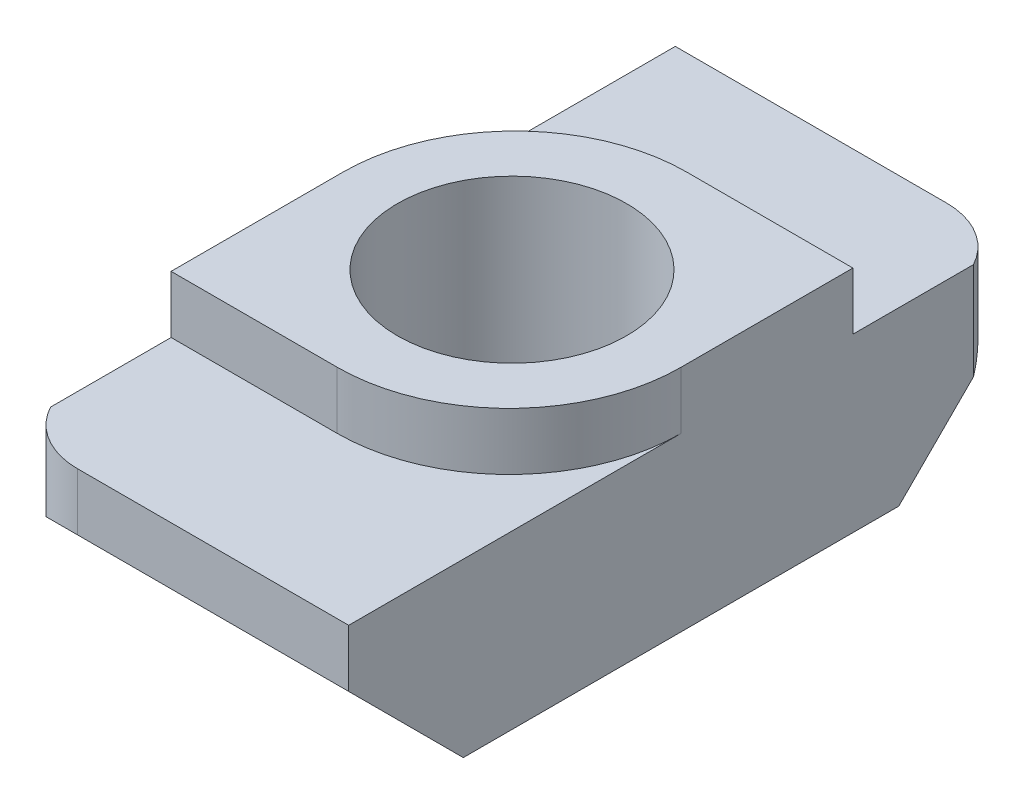
ISO-10303-21;
HEADER;
FILE_DESCRIPTION(('STEP AP214'),'2;1');
FILE_NAME('part.step','',(''),(''),'','','');
FILE_SCHEMA(('AUTOMOTIVE_DESIGN { 1 0 10303 214 1 1 1 1 }'));
ENDSEC;
DATA;
#1=APPLICATION_CONTEXT('core data for automotive mechanical design processes');
#2=APPLICATION_PROTOCOL_DEFINITION('international standard','automotive_design',2000,#1);
#3=PRODUCT_CONTEXT('',#1,'mechanical');
#4=PRODUCT('Part','Part','',(#3));
#5=PRODUCT_RELATED_PRODUCT_CATEGORY('part','',(#4));
#6=PRODUCT_DEFINITION_FORMATION('','',#4);
#7=PRODUCT_DEFINITION_CONTEXT('part definition',#1,'design');
#8=PRODUCT_DEFINITION('design','',#6,#7);
#9=PRODUCT_DEFINITION_SHAPE('','',#8);
#10=(LENGTH_UNIT() NAMED_UNIT(*) SI_UNIT(.MILLI.,.METRE.));
#11=(NAMED_UNIT(*) PLANE_ANGLE_UNIT() SI_UNIT($,.RADIAN.));
#12=(NAMED_UNIT(*) SI_UNIT($,.STERADIAN.) SOLID_ANGLE_UNIT());
#13=UNCERTAINTY_MEASURE_WITH_UNIT(LENGTH_MEASURE(1.E-05),#10,'distance_accuracy_value','');
#14=(GEOMETRIC_REPRESENTATION_CONTEXT(3) GLOBAL_UNCERTAINTY_ASSIGNED_CONTEXT((#13)) GLOBAL_UNIT_ASSIGNED_CONTEXT((#10,
#11,#12)) REPRESENTATION_CONTEXT('',''));
#15=CARTESIAN_POINT('',(0.,0.,0.));
#16=DIRECTION('',(0.,0.,1.));
#17=DIRECTION('',(1.,0.,0.));
#18=AXIS2_PLACEMENT_3D('',#15,#16,#17);
#19=CARTESIAN_POINT('',(-1.785369243065,-1.,4.4776));
#20=DIRECTION('',(0.,1.,0.));
#21=DIRECTION('',(0.,0.,1.));
#22=AXIS2_PLACEMENT_3D('',#19,#20,#21);
#23=CYLINDRICAL_SURFACE('',#22,1.3224);
#24=DIRECTION('',(0.,1.,0.));
#25=VECTOR('',#24,1.);
#26=CARTESIAN_POINT('',(-2.95000000000034,-1.,5.10400000000018));
#27=LINE('',#26,#25);
#28=CARTESIAN_POINT('',(-2.95000000000017,-1.,5.10400000000049));
#29=VERTEX_POINT('',#28);
#30=CARTESIAN_POINT('',(-2.95000000000017,-2.69599999999951,5.10400000000049));
#31=VERTEX_POINT('',#30);
#32=EDGE_CURVE('E114',#29,#31,#27,.F.);
#33=ORIENTED_EDGE('',*,*,#32,.T.);
#34=CARTESIAN_POINT('',(-1.785369243065,-3.3224,4.4776));
#35=DIRECTION('',(0.,-0.707106781186548,0.707106781186548));
#36=DIRECTION('',(0.,0.707106781186548,0.707106781186548));
#37=AXIS2_PLACEMENT_3D('',#34,#35,#36);
#38=ELLIPSE('',#37,1.87015601488218,1.3224);
#39=CARTESIAN_POINT('',(-1.785369243065,-2.,5.8));
#40=VERTEX_POINT('',#39);
#41=EDGE_CURVE('E118',#40,#31,#38,.T.);
#42=ORIENTED_EDGE('',*,*,#41,.F.);
#43=DIRECTION('',(0.,1.,0.));
#44=VECTOR('',#43,1.);
#45=CARTESIAN_POINT('',(-1.785369243065,-1.,5.8));
#46=LINE('',#45,#44);
#47=CARTESIAN_POINT('',(-1.785369243065,-1.,5.8));
#48=VERTEX_POINT('',#47);
#49=EDGE_CURVE('E116',#48,#40,#46,.F.);
#50=ORIENTED_EDGE('',*,*,#49,.F.);
#51=CARTESIAN_POINT('',(-1.785369243065,-1.,4.4776));
#52=DIRECTION('',(0.,1.,0.));
#53=DIRECTION('',(0.,0.,1.));
#54=AXIS2_PLACEMENT_3D('',#51,#52,#53);
#55=CIRCLE('',#54,1.3224);
#56=EDGE_CURVE('E18',#48,#29,#55,.F.);
#57=ORIENTED_EDGE('',*,*,#56,.T.);
#58=EDGE_LOOP('',(#33,#42,#50,#57));
#59=FACE_BOUND('',#58,.T.);
#60=ADVANCED_FACE('F14',(#59),#23,.T.);
#61=CARTESIAN_POINT('',(1.785369243065,-1.,-4.4776));
#62=DIRECTION('',(0.,1.,0.));
#63=DIRECTION('',(0.,0.,1.));
#64=AXIS2_PLACEMENT_3D('',#61,#62,#63);
#65=CYLINDRICAL_SURFACE('',#64,1.3224);
#66=DIRECTION('',(0.,1.,0.));
#67=VECTOR('',#66,1.);
#68=CARTESIAN_POINT('',(2.95,0.,-5.104));
#69=LINE('',#68,#67);
#70=CARTESIAN_POINT('',(2.95,-2.6959999999996,-5.1040000000004));
#71=VERTEX_POINT('',#70);
#72=CARTESIAN_POINT('',(2.95,-1.,-5.1040000000004));
#73=VERTEX_POINT('',#72);
#74=EDGE_CURVE('E122',#71,#73,#69,.T.);
#75=ORIENTED_EDGE('',*,*,#74,.F.);
#76=CARTESIAN_POINT('',(1.785369243065,-3.3224,-4.4776));
#77=DIRECTION('',(0.,-0.707106781186548,-0.707106781186548));
#78=DIRECTION('',(0.,0.707106781186548,-0.707106781186548));
#79=AXIS2_PLACEMENT_3D('',#76,#77,#78);
#80=ELLIPSE('',#79,1.87015601488218,1.3224);
#81=CARTESIAN_POINT('',(1.785369243065,-2.,-5.8));
#82=VERTEX_POINT('',#81);
#83=EDGE_CURVE('E231',#82,#71,#80,.T.);
#84=ORIENTED_EDGE('',*,*,#83,.F.);
#85=DIRECTION('',(0.,1.,0.));
#86=VECTOR('',#85,1.);
#87=CARTESIAN_POINT('',(1.785369243065,-2.,-5.8));
#88=LINE('',#87,#86);
#89=CARTESIAN_POINT('',(1.785369243065,-1.,-5.8));
#90=VERTEX_POINT('',#89);
#91=EDGE_CURVE('E192',#90,#82,#88,.F.);
#92=ORIENTED_EDGE('',*,*,#91,.F.);
#93=CARTESIAN_POINT('',(1.785369243065,-1.,-4.4776));
#94=DIRECTION('',(0.,1.,0.));
#95=DIRECTION('',(0.,0.,1.));
#96=AXIS2_PLACEMENT_3D('',#93,#94,#95);
#97=CIRCLE('',#96,1.3224);
#98=EDGE_CURVE('E194',#90,#73,#97,.F.);
#99=ORIENTED_EDGE('',*,*,#98,.T.);
#100=EDGE_LOOP('',(#75,#84,#92,#99));
#101=FACE_BOUND('',#100,.T.);
#102=ADVANCED_FACE('F335',(#101),#65,.T.);
#103=CARTESIAN_POINT('',(-2.95,-2.,-5.8));
#104=DIRECTION('',(0.,0.,-1.));
#105=DIRECTION('',(-1.,0.,0.));
#106=AXIS2_PLACEMENT_3D('',#103,#104,#105);
#107=PLANE('',#106);
#108=DIRECTION('',(0.,1.,0.));
#109=VECTOR('',#108,1.);
#110=CARTESIAN_POINT('',(-2.95,-2.,-5.8));
#111=LINE('',#110,#109);
#112=CARTESIAN_POINT('',(-2.95,-2.,-5.8));
#113=VERTEX_POINT('',#112);
#114=CARTESIAN_POINT('',(-2.95,-1.,-5.8));
#115=VERTEX_POINT('',#114);
#116=EDGE_CURVE('E186',#113,#115,#111,.T.);
#117=ORIENTED_EDGE('',*,*,#116,.T.);
#118=DIRECTION('',(1.,0.,0.));
#119=VECTOR('',#118,1.);
#120=CARTESIAN_POINT('',(-2.95,-1.,-5.8));
#121=LINE('',#120,#119);
#122=EDGE_CURVE('E230',#90,#115,#121,.F.);
#123=ORIENTED_EDGE('',*,*,#122,.F.);
#124=ORIENTED_EDGE('',*,*,#91,.T.);
#125=DIRECTION('',(1.,0.,0.));
#126=VECTOR('',#125,1.);
#127=CARTESIAN_POINT('',(-2.95,-2.,-5.8));
#128=LINE('',#127,#126);
#129=EDGE_CURVE('E201',#113,#82,#128,.T.);
#130=ORIENTED_EDGE('',*,*,#129,.F.);
#131=EDGE_LOOP('',(#117,#123,#124,#130));
#132=FACE_BOUND('',#131,.T.);
#133=ADVANCED_FACE('F316',(#132),#107,.T.);
#134=CARTESIAN_POINT('',(-2.95,-1.,-3.));
#135=DIRECTION('',(0.,0.,-1.));
#136=DIRECTION('',(-1.,0.,0.));
#137=AXIS2_PLACEMENT_3D('',#134,#135,#136);
#138=PLANE('',#137);
#139=DIRECTION('',(0.,1.,0.));
#140=VECTOR('',#139,1.);
#141=CARTESIAN_POINT('',(2.95,0.,-3.));
#142=LINE('',#141,#140);
#143=CARTESIAN_POINT('',(2.95,-1.,-3.));
#144=VERTEX_POINT('',#143);
#145=CARTESIAN_POINT('',(2.95,0.,-3.));
#146=VERTEX_POINT('',#145);
#147=EDGE_CURVE('E180',#144,#146,#142,.T.);
#148=ORIENTED_EDGE('',*,*,#147,.F.);
#149=DIRECTION('',(1.,0.,0.));
#150=VECTOR('',#149,1.);
#151=CARTESIAN_POINT('',(-2.95,-1.,-3.));
#152=LINE('',#151,#150);
#153=CARTESIAN_POINT('',(0.0500000000000002,-1.,-3.));
#154=VERTEX_POINT('',#153);
#155=EDGE_CURVE('E229',#154,#144,#152,.T.);
#156=ORIENTED_EDGE('',*,*,#155,.F.);
#157=DIRECTION('',(0.,1.,0.));
#158=VECTOR('',#157,1.);
#159=CARTESIAN_POINT('',(0.0500000000000004,0.,-3.));
#160=LINE('',#159,#158);
#161=CARTESIAN_POINT('',(0.0500000000000002,0.,-3.));
#162=VERTEX_POINT('',#161);
#163=EDGE_CURVE('E184',#162,#154,#160,.F.);
#164=ORIENTED_EDGE('',*,*,#163,.F.);
#165=DIRECTION('',(1.,0.,0.));
#166=VECTOR('',#165,1.);
#167=CARTESIAN_POINT('',(-2.95,0.,-3.));
#168=LINE('',#167,#166);
#169=EDGE_CURVE('E220',#146,#162,#168,.F.);
#170=ORIENTED_EDGE('',*,*,#169,.F.);
#171=EDGE_LOOP('',(#148,#156,#164,#170));
#172=FACE_BOUND('',#171,.T.);
#173=ADVANCED_FACE('F325',(#172),#138,.T.);
#174=CARTESIAN_POINT('',(0.05,0.,0.));
#175=DIRECTION('',(0.,1.,0.));
#176=DIRECTION('',(0.,0.,1.));
#177=AXIS2_PLACEMENT_3D('',#174,#175,#176);
#178=CYLINDRICAL_SURFACE('',#177,3.);
#179=CARTESIAN_POINT('',(0.05,-1.,0.));
#180=DIRECTION('',(0.,1.,0.));
#181=DIRECTION('',(0.,0.,1.));
#182=AXIS2_PLACEMENT_3D('',#179,#180,#181);
#183=CIRCLE('',#182,3.);
#184=CARTESIAN_POINT('',(-2.95,-1.,0.));
#185=VERTEX_POINT('',#184);
#186=EDGE_CURVE('E226',#185,#154,#183,.F.);
#187=ORIENTED_EDGE('',*,*,#186,.F.);
#188=DIRECTION('',(0.,1.,0.));
#189=VECTOR('',#188,1.);
#190=CARTESIAN_POINT('',(-2.95,0.,0.));
#191=LINE('',#190,#189);
#192=CARTESIAN_POINT('',(-2.95,0.,0.));
#193=VERTEX_POINT('',#192);
#194=EDGE_CURVE('E123',#185,#193,#191,.T.);
#195=ORIENTED_EDGE('',*,*,#194,.T.);
#196=CARTESIAN_POINT('',(0.05,0.,0.));
#197=DIRECTION('',(0.,1.,0.));
#198=DIRECTION('',(0.,0.,1.));
#199=AXIS2_PLACEMENT_3D('',#196,#197,#198);
#200=CIRCLE('',#199,3.);
#201=EDGE_CURVE('E134',#162,#193,#200,.T.);
#202=ORIENTED_EDGE('',*,*,#201,.F.);
#203=ORIENTED_EDGE('',*,*,#163,.T.);
#204=EDGE_LOOP('',(#187,#195,#202,#203));
#205=FACE_BOUND('',#204,.T.);
#206=ADVANCED_FACE('F309',(#205),#178,.T.);
#207=CARTESIAN_POINT('',(0.,0.,0.));
#208=DIRECTION('',(0.,1.,0.));
#209=DIRECTION('',(0.,0.,1.));
#210=AXIS2_PLACEMENT_3D('',#207,#208,#209);
#211=CYLINDRICAL_SURFACE('',#210,2.);
#212=CARTESIAN_POINT('',(0.,0.,0.));
#213=DIRECTION('',(0.,1.,0.));
#214=DIRECTION('',(0.,0.,1.));
#215=AXIS2_PLACEMENT_3D('',#212,#213,#214);
#216=CIRCLE('',#215,2.);
#217=CARTESIAN_POINT('',(0.,0.,2.));
#218=VERTEX_POINT('',#217);
#219=EDGE_CURVE('E129',#218,#218,#216,.F.);
#220=ORIENTED_EDGE('',*,*,#219,.F.);
#221=EDGE_LOOP('',(#220));
#222=FACE_BOUND('',#221,.T.);
#223=CARTESIAN_POINT('',(0.,-4.,0.));
#224=DIRECTION('',(0.,1.,0.));
#225=DIRECTION('',(0.,0.,1.));
#226=AXIS2_PLACEMENT_3D('',#223,#224,#225);
#227=CIRCLE('',#226,2.);
#228=CARTESIAN_POINT('',(0.,-4.,2.));
#229=VERTEX_POINT('',#228);
#230=EDGE_CURVE('E167',#229,#229,#227,.T.);
#231=ORIENTED_EDGE('',*,*,#230,.F.);
#232=EDGE_LOOP('',(#231));
#233=FACE_BOUND('',#232,.T.);
#234=ADVANCED_FACE('F333',(#222,#233),#211,.F.);
#235=CARTESIAN_POINT('',(-2.95,-1.,5.8));
#236=DIRECTION('',(0.,0.,1.));
#237=DIRECTION('',(1.,0.,0.));
#238=AXIS2_PLACEMENT_3D('',#235,#236,#237);
#239=PLANE('',#238);
#240=DIRECTION('',(0.,1.,0.));
#241=VECTOR('',#240,1.);
#242=CARTESIAN_POINT('',(2.95,0.,5.8));
#243=LINE('',#242,#241);
#244=CARTESIAN_POINT('',(2.95,-1.,5.8));
#245=VERTEX_POINT('',#244);
#246=CARTESIAN_POINT('',(2.95,-2.,5.8));
#247=VERTEX_POINT('',#246);
#248=EDGE_CURVE('E126',#245,#247,#243,.F.);
#249=ORIENTED_EDGE('',*,*,#248,.F.);
#250=DIRECTION('',(1.,0.,0.));
#251=VECTOR('',#250,1.);
#252=CARTESIAN_POINT('',(-2.95,-1.,5.8));
#253=LINE('',#252,#251);
#254=EDGE_CURVE('E109',#48,#245,#253,.T.);
#255=ORIENTED_EDGE('',*,*,#254,.F.);
#256=ORIENTED_EDGE('',*,*,#49,.T.);
#257=DIRECTION('',(1.,0.,0.));
#258=VECTOR('',#257,1.);
#259=CARTESIAN_POINT('',(-2.95,-2.,5.8));
#260=LINE('',#259,#258);
#261=EDGE_CURVE('E214',#247,#40,#260,.F.);
#262=ORIENTED_EDGE('',*,*,#261,.F.);
#263=EDGE_LOOP('',(#249,#255,#256,#262));
#264=FACE_BOUND('',#263,.T.);
#265=ADVANCED_FACE('F125',(#264),#239,.T.);
#266=CARTESIAN_POINT('',(2.95,0.,0.));
#267=DIRECTION('',(1.,0.,0.));
#268=DIRECTION('',(0.,0.,-1.));
#269=AXIS2_PLACEMENT_3D('',#266,#267,#268);
#270=PLANE('',#269);
#271=DIRECTION('',(0.,0.,-1.));
#272=VECTOR('',#271,1.);
#273=CARTESIAN_POINT('',(2.95,-4.,3.8));
#274=LINE('',#273,#272);
#275=CARTESIAN_POINT('',(2.95,-4.,-3.8));
#276=VERTEX_POINT('',#275);
#277=CARTESIAN_POINT('',(2.95,-4.,3.8));
#278=VERTEX_POINT('',#277);
#279=EDGE_CURVE('E168',#276,#278,#274,.F.);
#280=ORIENTED_EDGE('',*,*,#279,.F.);
#281=DIRECTION('',(0.,0.707106781186548,-0.707106781186548));
#282=VECTOR('',#281,1.);
#283=CARTESIAN_POINT('',(2.95,-4.,-3.8));
#284=LINE('',#283,#282);
#285=EDGE_CURVE('E233',#71,#276,#284,.F.);
#286=ORIENTED_EDGE('',*,*,#285,.F.);
#287=ORIENTED_EDGE('',*,*,#74,.T.);
#288=DIRECTION('',(0.,0.,1.));
#289=VECTOR('',#288,1.);
#290=CARTESIAN_POINT('',(2.95,-1.,3.));
#291=LINE('',#290,#289);
#292=EDGE_CURVE('E252',#144,#73,#291,.F.);
#293=ORIENTED_EDGE('',*,*,#292,.F.);
#294=ORIENTED_EDGE('',*,*,#147,.T.);
#295=DIRECTION('',(0.,0.,1.));
#296=VECTOR('',#295,1.);
#297=CARTESIAN_POINT('',(2.95,0.,-3.));
#298=LINE('',#297,#296);
#299=CARTESIAN_POINT('',(2.95,0.,0.));
#300=VERTEX_POINT('',#299);
#301=EDGE_CURVE('E224',#300,#146,#298,.F.);
#302=ORIENTED_EDGE('',*,*,#301,.F.);
#303=DIRECTION('',(0.,1.,0.));
#304=VECTOR('',#303,1.);
#305=CARTESIAN_POINT('',(2.95,0.,0.));
#306=LINE('',#305,#304);
#307=CARTESIAN_POINT('',(2.95,-1.,0.));
#308=VERTEX_POINT('',#307);
#309=EDGE_CURVE('E175',#308,#300,#306,.T.);
#310=ORIENTED_EDGE('',*,*,#309,.F.);
#311=DIRECTION('',(0.,0.,1.));
#312=VECTOR('',#311,1.);
#313=CARTESIAN_POINT('',(2.95,-1.,3.));
#314=LINE('',#313,#312);
#315=EDGE_CURVE('E128',#245,#308,#314,.F.);
#316=ORIENTED_EDGE('',*,*,#315,.F.);
#317=ORIENTED_EDGE('',*,*,#248,.T.);
#318=DIRECTION('',(0.,-0.707106781186548,-0.707106781186548));
#319=VECTOR('',#318,1.);
#320=CARTESIAN_POINT('',(2.95,-2.,5.8));
#321=LINE('',#320,#319);
#322=EDGE_CURVE('E173',#278,#247,#321,.F.);
#323=ORIENTED_EDGE('',*,*,#322,.F.);
#324=EDGE_LOOP('',(#280,#286,#287,#293,#294,#302,#310,#316,#317,#323));
#325=FACE_BOUND('',#324,.T.);
#326=ADVANCED_FACE('F296',(#325),#270,.T.);
#327=CARTESIAN_POINT('',(-0.05,0.,0.));
#328=DIRECTION('',(0.,1.,0.));
#329=DIRECTION('',(0.,0.,1.));
#330=AXIS2_PLACEMENT_3D('',#327,#328,#329);
#331=CYLINDRICAL_SURFACE('',#330,3.);
#332=CARTESIAN_POINT('',(-0.05,-1.,0.));
#333=DIRECTION('',(0.,1.,0.));
#334=DIRECTION('',(0.,0.,1.));
#335=AXIS2_PLACEMENT_3D('',#332,#333,#334);
#336=CIRCLE('',#335,3.);
#337=CARTESIAN_POINT('',(-0.0500000000000001,-1.,3.));
#338=VERTEX_POINT('',#337);
#339=EDGE_CURVE('E131',#308,#338,#336,.F.);
#340=ORIENTED_EDGE('',*,*,#339,.F.);
#341=ORIENTED_EDGE('',*,*,#309,.T.);
#342=CARTESIAN_POINT('',(-0.05,0.,0.));
#343=DIRECTION('',(0.,1.,0.));
#344=DIRECTION('',(0.,0.,1.));
#345=AXIS2_PLACEMENT_3D('',#342,#343,#344);
#346=CIRCLE('',#345,3.);
#347=CARTESIAN_POINT('',(-0.0500000000000001,0.,3.));
#348=VERTEX_POINT('',#347);
#349=EDGE_CURVE('E221',#348,#300,#346,.T.);
#350=ORIENTED_EDGE('',*,*,#349,.F.);
#351=DIRECTION('',(0.,1.,0.));
#352=VECTOR('',#351,1.);
#353=CARTESIAN_POINT('',(-0.0500000000000001,0.,3.));
#354=LINE('',#353,#352);
#355=EDGE_CURVE('E171',#338,#348,#354,.T.);
#356=ORIENTED_EDGE('',*,*,#355,.F.);
#357=EDGE_LOOP('',(#340,#341,#350,#356));
#358=FACE_BOUND('',#357,.T.);
#359=ADVANCED_FACE('F301',(#358),#331,.T.);
#360=CARTESIAN_POINT('',(-2.95,0.,3.));
#361=DIRECTION('',(0.,0.,1.));
#362=DIRECTION('',(1.,0.,0.));
#363=AXIS2_PLACEMENT_3D('',#360,#361,#362);
#364=PLANE('',#363);
#365=ORIENTED_EDGE('',*,*,#355,.T.);
#366=DIRECTION('',(1.,0.,0.));
#367=VECTOR('',#366,1.);
#368=CARTESIAN_POINT('',(-2.95,0.,3.));
#369=LINE('',#368,#367);
#370=CARTESIAN_POINT('',(-2.95,0.,3.));
#371=VERTEX_POINT('',#370);
#372=EDGE_CURVE('E225',#371,#348,#369,.T.);
#373=ORIENTED_EDGE('',*,*,#372,.F.);
#374=DIRECTION('',(0.,1.,0.));
#375=VECTOR('',#374,1.);
#376=CARTESIAN_POINT('',(-2.95,0.,3.));
#377=LINE('',#376,#375);
#378=CARTESIAN_POINT('',(-2.95,-1.,3.));
#379=VERTEX_POINT('',#378);
#380=EDGE_CURVE('E33',#371,#379,#377,.F.);
#381=ORIENTED_EDGE('',*,*,#380,.T.);
#382=DIRECTION('',(1.,0.,0.));
#383=VECTOR('',#382,1.);
#384=CARTESIAN_POINT('',(-2.95,-1.,3.));
#385=LINE('',#384,#383);
#386=EDGE_CURVE('E157',#338,#379,#385,.F.);
#387=ORIENTED_EDGE('',*,*,#386,.F.);
#388=EDGE_LOOP('',(#365,#373,#381,#387));
#389=FACE_BOUND('',#388,.T.);
#390=ADVANCED_FACE('F302',(#389),#364,.T.);
#391=CARTESIAN_POINT('',(-2.95,-2.,5.8));
#392=DIRECTION('',(0.,-0.707106781186548,0.707106781186548));
#393=DIRECTION('',(0.,-0.707106781186548,-0.707106781186548));
#394=AXIS2_PLACEMENT_3D('',#391,#392,#393);
#395=PLANE('',#394);
#396=ORIENTED_EDGE('',*,*,#41,.T.);
#397=DIRECTION('',(0.,-0.707106781186548,-0.707106781186548));
#398=VECTOR('',#397,1.);
#399=CARTESIAN_POINT('',(-2.95,-2.696,5.104));
#400=LINE('',#399,#398);
#401=CARTESIAN_POINT('',(-2.95,-4.,3.8));
#402=VERTEX_POINT('',#401);
#403=EDGE_CURVE('E153',#31,#402,#400,.T.);
#404=ORIENTED_EDGE('',*,*,#403,.T.);
#405=DIRECTION('',(1.,0.,0.));
#406=VECTOR('',#405,1.);
#407=CARTESIAN_POINT('',(-2.95,-4.,3.8));
#408=LINE('',#407,#406);
#409=EDGE_CURVE('E164',#278,#402,#408,.F.);
#410=ORIENTED_EDGE('',*,*,#409,.F.);
#411=ORIENTED_EDGE('',*,*,#322,.T.);
#412=ORIENTED_EDGE('',*,*,#261,.T.);
#413=EDGE_LOOP('',(#396,#404,#410,#411,#412));
#414=FACE_BOUND('',#413,.T.);
#415=ADVANCED_FACE('F286',(#414),#395,.T.);
#416=CARTESIAN_POINT('',(-2.95,-4.,3.8));
#417=DIRECTION('',(0.,-1.,0.));
#418=DIRECTION('',(0.,0.,-1.));
#419=AXIS2_PLACEMENT_3D('',#416,#417,#418);
#420=PLANE('',#419);
#421=ORIENTED_EDGE('',*,*,#230,.T.);
#422=EDGE_LOOP('',(#421));
#423=FACE_BOUND('',#422,.T.);
#424=ORIENTED_EDGE('',*,*,#409,.T.);
#425=DIRECTION('',(0.,0.,-1.));
#426=VECTOR('',#425,1.);
#427=CARTESIAN_POINT('',(-2.95,-4.,0.));
#428=LINE('',#427,#426);
#429=CARTESIAN_POINT('',(-2.95,-4.,-3.8));
#430=VERTEX_POINT('',#429);
#431=EDGE_CURVE('E156',#402,#430,#428,.T.);
#432=ORIENTED_EDGE('',*,*,#431,.T.);
#433=DIRECTION('',(1.,0.,0.));
#434=VECTOR('',#433,1.);
#435=CARTESIAN_POINT('',(-2.95,-4.,-3.8));
#436=LINE('',#435,#434);
#437=EDGE_CURVE('E198',#276,#430,#436,.F.);
#438=ORIENTED_EDGE('',*,*,#437,.F.);
#439=ORIENTED_EDGE('',*,*,#279,.T.);
#440=EDGE_LOOP('',(#424,#432,#438,#439));
#441=FACE_BOUND('',#440,.T.);
#442=ADVANCED_FACE('F295',(#423,#441),#420,.T.);
#443=CARTESIAN_POINT('',(-2.95,-4.,-3.8));
#444=DIRECTION('',(0.,-0.707106781186548,-0.707106781186548));
#445=DIRECTION('',(0.,0.707106781186548,-0.707106781186548));
#446=AXIS2_PLACEMENT_3D('',#443,#444,#445);
#447=PLANE('',#446);
#448=ORIENTED_EDGE('',*,*,#83,.T.);
#449=ORIENTED_EDGE('',*,*,#285,.T.);
#450=ORIENTED_EDGE('',*,*,#437,.T.);
#451=DIRECTION('',(0.,0.707106781186548,-0.707106781186548));
#452=VECTOR('',#451,1.);
#453=CARTESIAN_POINT('',(-2.95,-4.,-3.8));
#454=LINE('',#453,#452);
#455=EDGE_CURVE('E150',#430,#113,#454,.T.);
#456=ORIENTED_EDGE('',*,*,#455,.T.);
#457=ORIENTED_EDGE('',*,*,#129,.T.);
#458=EDGE_LOOP('',(#448,#449,#450,#456,#457));
#459=FACE_BOUND('',#458,.T.);
#460=ADVANCED_FACE('F319',(#459),#447,.T.);
#461=CARTESIAN_POINT('',(-2.95,-1.,3.));
#462=DIRECTION('',(0.,1.,0.));
#463=DIRECTION('',(0.,0.,1.));
#464=AXIS2_PLACEMENT_3D('',#461,#462,#463);
#465=PLANE('',#464);
#466=ORIENTED_EDGE('',*,*,#292,.T.);
#467=ORIENTED_EDGE('',*,*,#98,.F.);
#468=ORIENTED_EDGE('',*,*,#122,.T.);
#469=DIRECTION('',(0.,0.,-1.));
#470=VECTOR('',#469,1.);
#471=CARTESIAN_POINT('',(-2.95,-1.,0.));
#472=LINE('',#471,#470);
#473=EDGE_CURVE('E145',#115,#185,#472,.F.);
#474=ORIENTED_EDGE('',*,*,#473,.T.);
#475=ORIENTED_EDGE('',*,*,#186,.T.);
#476=ORIENTED_EDGE('',*,*,#155,.T.);
#477=EDGE_LOOP('',(#466,#467,#468,#474,#475,#476));
#478=FACE_BOUND('',#477,.T.);
#479=ADVANCED_FACE('F313',(#478),#465,.T.);
#480=CARTESIAN_POINT('',(-2.95,0.,-3.));
#481=DIRECTION('',(0.,1.,0.));
#482=DIRECTION('',(0.,0.,1.));
#483=AXIS2_PLACEMENT_3D('',#480,#481,#482);
#484=PLANE('',#483);
#485=ORIENTED_EDGE('',*,*,#219,.T.);
#486=EDGE_LOOP('',(#485));
#487=FACE_BOUND('',#486,.T.);
#488=ORIENTED_EDGE('',*,*,#169,.T.);
#489=ORIENTED_EDGE('',*,*,#201,.T.);
#490=DIRECTION('',(0.,0.,-1.));
#491=VECTOR('',#490,1.);
#492=CARTESIAN_POINT('',(-2.95,0.,0.));
#493=LINE('',#492,#491);
#494=EDGE_CURVE('E24',#193,#371,#493,.F.);
#495=ORIENTED_EDGE('',*,*,#494,.T.);
#496=ORIENTED_EDGE('',*,*,#372,.T.);
#497=ORIENTED_EDGE('',*,*,#349,.T.);
#498=ORIENTED_EDGE('',*,*,#301,.T.);
#499=EDGE_LOOP('',(#488,#489,#495,#496,#497,#498));
#500=FACE_BOUND('',#499,.T.);
#501=ADVANCED_FACE('F304',(#487,#500),#484,.T.);
#502=CARTESIAN_POINT('',(-2.95,-1.,3.));
#503=DIRECTION('',(0.,1.,0.));
#504=DIRECTION('',(0.,0.,1.));
#505=AXIS2_PLACEMENT_3D('',#502,#503,#504);
#506=PLANE('',#505);
#507=DIRECTION('',(0.,0.,-1.));
#508=VECTOR('',#507,1.);
#509=CARTESIAN_POINT('',(-2.95,-1.,0.));
#510=LINE('',#509,#508);
#511=EDGE_CURVE('E9',#379,#29,#510,.F.);
#512=ORIENTED_EDGE('',*,*,#511,.T.);
#513=ORIENTED_EDGE('',*,*,#56,.F.);
#514=ORIENTED_EDGE('',*,*,#254,.T.);
#515=ORIENTED_EDGE('',*,*,#315,.T.);
#516=ORIENTED_EDGE('',*,*,#339,.T.);
#517=ORIENTED_EDGE('',*,*,#386,.T.);
#518=EDGE_LOOP('',(#512,#513,#514,#515,#516,#517));
#519=FACE_BOUND('',#518,.T.);
#520=ADVANCED_FACE('F107',(#519),#506,.T.);
#521=CARTESIAN_POINT('',(-2.95,0.,0.));
#522=DIRECTION('',(1.,0.,0.));
#523=DIRECTION('',(0.,0.,-1.));
#524=AXIS2_PLACEMENT_3D('',#521,#522,#523);
#525=PLANE('',#524);
#526=ORIENTED_EDGE('',*,*,#511,.F.);
#527=ORIENTED_EDGE('',*,*,#380,.F.);
#528=ORIENTED_EDGE('',*,*,#494,.F.);
#529=ORIENTED_EDGE('',*,*,#194,.F.);
#530=ORIENTED_EDGE('',*,*,#473,.F.);
#531=ORIENTED_EDGE('',*,*,#116,.F.);
#532=ORIENTED_EDGE('',*,*,#455,.F.);
#533=ORIENTED_EDGE('',*,*,#431,.F.);
#534=ORIENTED_EDGE('',*,*,#403,.F.);
#535=ORIENTED_EDGE('',*,*,#32,.F.);
#536=EDGE_LOOP('',(#526,#527,#528,#529,#530,#531,#532,#533,#534,#535));
#537=FACE_BOUND('',#536,.T.);
#538=ADVANCED_FACE('F16',(#537),#525,.F.);
#539=CLOSED_SHELL('',(#60,#102,#133,#173,#206,#234,#265,#326,#359,#390,#415,#442,#460,#479,#501,
#520,#538));
#540=MANIFOLD_SOLID_BREP('B1',#539);
#541=ADVANCED_BREP_SHAPE_REPRESENTATION('',(#18,#540),#14);
#542=SHAPE_DEFINITION_REPRESENTATION(#9,#541);
ENDSEC;
END-ISO-10303-21;
